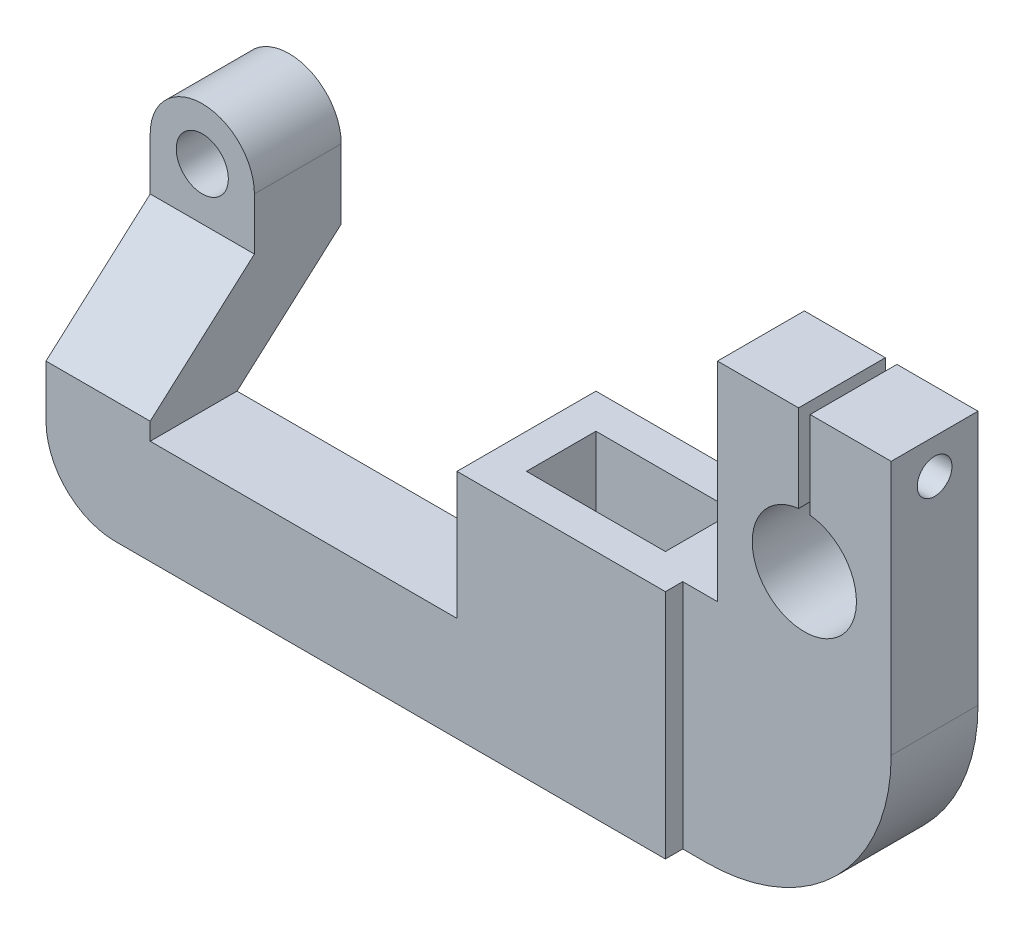
ISO-10303-21;
HEADER;
FILE_DESCRIPTION(('STEP AP214'),'2;1');
FILE_NAME('part.step','',(''),(''),'','','');
FILE_SCHEMA(('AUTOMOTIVE_DESIGN { 1 0 10303 214 1 1 1 1 }'));
ENDSEC;
DATA;
#1=APPLICATION_CONTEXT('core data for automotive mechanical design processes');
#2=APPLICATION_PROTOCOL_DEFINITION('international standard','automotive_design',2000,#1);
#3=PRODUCT_CONTEXT('',#1,'mechanical');
#4=PRODUCT('Part','Part','',(#3));
#5=PRODUCT_RELATED_PRODUCT_CATEGORY('part','',(#4));
#6=PRODUCT_DEFINITION_FORMATION('','',#4);
#7=PRODUCT_DEFINITION_CONTEXT('part definition',#1,'design');
#8=PRODUCT_DEFINITION('design','',#6,#7);
#9=PRODUCT_DEFINITION_SHAPE('','',#8);
#10=(LENGTH_UNIT() NAMED_UNIT(*) SI_UNIT(.MILLI.,.METRE.));
#11=(NAMED_UNIT(*) PLANE_ANGLE_UNIT() SI_UNIT($,.RADIAN.));
#12=(NAMED_UNIT(*) SI_UNIT($,.STERADIAN.) SOLID_ANGLE_UNIT());
#13=UNCERTAINTY_MEASURE_WITH_UNIT(LENGTH_MEASURE(1.E-05),#10,'distance_accuracy_value','');
#14=(GEOMETRIC_REPRESENTATION_CONTEXT(3) GLOBAL_UNCERTAINTY_ASSIGNED_CONTEXT((#13)) GLOBAL_UNIT_ASSIGNED_CONTEXT((#10,
#11,#12)) REPRESENTATION_CONTEXT('',''));
#15=CARTESIAN_POINT('',(0.,0.,0.));
#16=DIRECTION('',(0.,0.,1.));
#17=DIRECTION('',(1.,0.,0.));
#18=AXIS2_PLACEMENT_3D('',#15,#16,#17);
#19=CARTESIAN_POINT('',(28.9370419387053,0.,-6.));
#20=DIRECTION('',(-1.,0.,0.));
#21=DIRECTION('',(0.,0.,1.));
#22=AXIS2_PLACEMENT_3D('',#19,#20,#21);
#23=PLANE('',#22);
#24=DIRECTION('',(0.,1.,0.));
#25=VECTOR('',#24,1.);
#26=CARTESIAN_POINT('',(28.9370419387053,0.,0.));
#27=LINE('',#26,#25);
#28=CARTESIAN_POINT('',(28.9370419387053,-11.3553757337916,0.));
#29=VERTEX_POINT('',#28);
#30=CARTESIAN_POINT('',(28.9370419387053,28.6446242662084,0.));
#31=VERTEX_POINT('',#30);
#32=EDGE_CURVE('E246',#29,#31,#27,.T.);
#33=ORIENTED_EDGE('',*,*,#32,.F.);
#34=DIRECTION('',(0.,0.,1.));
#35=VECTOR('',#34,1.);
#36=CARTESIAN_POINT('',(28.9370419387053,-11.3553757337916,-6.));
#37=LINE('',#36,#35);
#38=CARTESIAN_POINT('',(28.9370419387053,-11.3553757337916,-6.));
#39=VERTEX_POINT('',#38);
#40=EDGE_CURVE('E420',#39,#29,#37,.T.);
#41=ORIENTED_EDGE('',*,*,#40,.F.);
#42=DIRECTION('',(0.,-1.,0.));
#43=VECTOR('',#42,1.);
#44=CARTESIAN_POINT('',(28.9370419387053,0.,-6.));
#45=LINE('',#44,#43);
#46=CARTESIAN_POINT('',(28.9370419387053,28.6446242662084,-6.));
#47=VERTEX_POINT('',#46);
#48=EDGE_CURVE('E389',#47,#39,#45,.T.);
#49=ORIENTED_EDGE('',*,*,#48,.F.);
#50=DIRECTION('',(0.,0.,1.));
#51=VECTOR('',#50,1.);
#52=CARTESIAN_POINT('',(28.9370419387053,28.6446242662084,-6.));
#53=LINE('',#52,#51);
#54=EDGE_CURVE('E416',#47,#31,#53,.T.);
#55=ORIENTED_EDGE('',*,*,#54,.T.);
#56=EDGE_LOOP('',(#33,#41,#49,#55));
#57=FACE_BOUND('',#56,.T.);
#58=ADVANCED_FACE('F41',(#57),#23,.F.);
#59=CARTESIAN_POINT('',(-69.0629580612947,34.6446242662084,-15.));
#60=DIRECTION('',(0.,0.,1.));
#61=DIRECTION('',(1.,0.,0.));
#62=AXIS2_PLACEMENT_3D('',#59,#60,#61);
#63=CYLINDRICAL_SURFACE('',#62,9.00000000000001);
#64=CARTESIAN_POINT('',(-69.0629580612947,34.6446242662084,0.));
#65=DIRECTION('',(0.,0.,1.));
#66=DIRECTION('',(1.,0.,0.));
#67=AXIS2_PLACEMENT_3D('',#64,#65,#66);
#68=CIRCLE('',#67,9.00000000000001);
#69=CARTESIAN_POINT('',(-60.0629580612947,34.6446242662084,0.));
#70=VERTEX_POINT('',#69);
#71=CARTESIAN_POINT('',(-78.0629580612947,34.6446242662084,0.));
#72=VERTEX_POINT('',#71);
#73=EDGE_CURVE('E497',#70,#72,#68,.T.);
#74=ORIENTED_EDGE('',*,*,#73,.F.);
#75=DIRECTION('',(0.,0.,1.));
#76=VECTOR('',#75,1.);
#77=CARTESIAN_POINT('',(-60.0629580612947,34.6446242662084,-15.));
#78=LINE('',#77,#76);
#79=CARTESIAN_POINT('',(-60.0629580612947,34.6446242662084,-15.));
#80=VERTEX_POINT('',#79);
#81=EDGE_CURVE('E528',#80,#70,#78,.T.);
#82=ORIENTED_EDGE('',*,*,#81,.F.);
#83=CARTESIAN_POINT('',(-69.0629580612947,34.6446242662084,-15.));
#84=DIRECTION('',(0.,0.,1.));
#85=DIRECTION('',(1.,0.,0.));
#86=AXIS2_PLACEMENT_3D('',#83,#84,#85);
#87=CIRCLE('',#86,9.00000000000001);
#88=CARTESIAN_POINT('',(-78.0629580612947,34.6446242662084,-15.));
#89=VERTEX_POINT('',#88);
#90=EDGE_CURVE('E501',#80,#89,#87,.T.);
#91=ORIENTED_EDGE('',*,*,#90,.T.);
#92=DIRECTION('',(0.,0.,1.));
#93=VECTOR('',#92,1.);
#94=CARTESIAN_POINT('',(-78.0629580612947,34.6446242662084,-15.));
#95=LINE('',#94,#93);
#96=EDGE_CURVE('E513',#89,#72,#95,.T.);
#97=ORIENTED_EDGE('',*,*,#96,.T.);
#98=EDGE_LOOP('',(#74,#82,#91,#97));
#99=FACE_BOUND('',#98,.T.);
#100=ADVANCED_FACE('F43',(#99),#63,.T.);
#101=CARTESIAN_POINT('',(-60.0629580612947,34.6446242662084,-15.));
#102=DIRECTION('',(1.,0.,0.));
#103=DIRECTION('',(0.,0.,-1.));
#104=AXIS2_PLACEMENT_3D('',#101,#102,#103);
#105=PLANE('',#104);
#106=DIRECTION('',(0.,0.66436383882992,-0.74740931868366));
#107=VECTOR('',#106,1.);
#108=CARTESIAN_POINT('',(-60.0629580612947,37.0653139213809,-12.848275862069));
#109=LINE('',#108,#107);
#110=CARTESIAN_POINT('',(-60.0629580612947,9.64462426620844,18.));
#111=VERTEX_POINT('',#110);
#112=CARTESIAN_POINT('',(-60.0629580612947,25.6446242662084,0.));
#113=VERTEX_POINT('',#112);
#114=EDGE_CURVE('E473',#111,#113,#109,.T.);
#115=ORIENTED_EDGE('',*,*,#114,.F.);
#116=DIRECTION('',(0.,-1.,0.));
#117=VECTOR('',#116,1.);
#118=CARTESIAN_POINT('',(-60.0629580612947,0.,18.));
#119=LINE('',#118,#117);
#120=CARTESIAN_POINT('',(-60.0629580612947,6.64462426620844,18.));
#121=VERTEX_POINT('',#120);
#122=EDGE_CURVE('E484',#111,#121,#119,.T.);
#123=ORIENTED_EDGE('',*,*,#122,.T.);
#124=DIRECTION('',(0.,0.,-1.));
#125=VECTOR('',#124,1.);
#126=CARTESIAN_POINT('',(-60.0629580612947,6.64462426620844,18.));
#127=LINE('',#126,#125);
#128=CARTESIAN_POINT('',(-60.0629580612947,6.64462426620844,3.));
#129=VERTEX_POINT('',#128);
#130=EDGE_CURVE('E488',#121,#129,#127,.T.);
#131=ORIENTED_EDGE('',*,*,#130,.T.);
#132=DIRECTION('',(0.,-0.66436383882992,0.74740931868366));
#133=VECTOR('',#132,1.);
#134=CARTESIAN_POINT('',(-60.0629580612947,27.9411759903464,-20.9586206896552));
#135=LINE('',#134,#133);
#136=CARTESIAN_POINT('',(-60.0629580612947,22.6446242662084,-15.));
#137=VERTEX_POINT('',#136);
#138=EDGE_CURVE('E476',#137,#129,#135,.T.);
#139=ORIENTED_EDGE('',*,*,#138,.F.);
#140=DIRECTION('',(0.,1.,0.));
#141=VECTOR('',#140,1.);
#142=CARTESIAN_POINT('',(-60.0629580612947,34.6446242662084,-15.));
#143=LINE('',#142,#141);
#144=EDGE_CURVE('E510',#137,#80,#143,.T.);
#145=ORIENTED_EDGE('',*,*,#144,.T.);
#146=ORIENTED_EDGE('',*,*,#81,.T.);
#147=DIRECTION('',(0.,1.,0.));
#148=VECTOR('',#147,1.);
#149=CARTESIAN_POINT('',(-60.0629580612947,34.6446242662084,0.));
#150=LINE('',#149,#148);
#151=EDGE_CURVE('E506',#113,#70,#150,.T.);
#152=ORIENTED_EDGE('',*,*,#151,.F.);
#153=EDGE_LOOP('',(#115,#123,#131,#139,#145,#146,#152));
#154=FACE_BOUND('',#153,.T.);
#155=ADVANCED_FACE('F561',(#154),#105,.T.);
#156=CARTESIAN_POINT('',(-78.0629580612947,34.6446242662084,-15.));
#157=DIRECTION('',(-1.,0.,0.));
#158=DIRECTION('',(0.,0.,1.));
#159=AXIS2_PLACEMENT_3D('',#156,#157,#158);
#160=PLANE('',#159);
#161=DIRECTION('',(0.,-0.66436383882992,0.74740931868366));
#162=VECTOR('',#161,1.);
#163=CARTESIAN_POINT('',(-78.0629580612947,9.64462426620844,18.));
#164=LINE('',#163,#162);
#165=CARTESIAN_POINT('',(-78.0629580612947,25.6446242662084,0.));
#166=VERTEX_POINT('',#165);
#167=CARTESIAN_POINT('',(-78.0629580612947,9.64462426620844,18.));
#168=VERTEX_POINT('',#167);
#169=EDGE_CURVE('E457',#166,#168,#164,.T.);
#170=ORIENTED_EDGE('',*,*,#169,.F.);
#171=DIRECTION('',(0.,-1.,0.));
#172=VECTOR('',#171,1.);
#173=CARTESIAN_POINT('',(-78.0629580612947,34.6446242662084,0.));
#174=LINE('',#173,#172);
#175=EDGE_CURVE('E517',#72,#166,#174,.T.);
#176=ORIENTED_EDGE('',*,*,#175,.F.);
#177=ORIENTED_EDGE('',*,*,#96,.F.);
#178=DIRECTION('',(0.,-1.,0.));
#179=VECTOR('',#178,1.);
#180=CARTESIAN_POINT('',(-78.0629580612947,34.6446242662084,-15.));
#181=LINE('',#180,#179);
#182=CARTESIAN_POINT('',(-78.0629580612947,22.6446242662084,-15.));
#183=VERTEX_POINT('',#182);
#184=EDGE_CURVE('E505',#89,#183,#181,.T.);
#185=ORIENTED_EDGE('',*,*,#184,.T.);
#186=DIRECTION('',(0.,0.66436383882992,-0.74740931868366));
#187=VECTOR('',#186,1.);
#188=CARTESIAN_POINT('',(-78.0629580612947,6.64462426620844,3.));
#189=LINE('',#188,#187);
#190=CARTESIAN_POINT('',(-78.0629580612947,6.64462426620844,3.));
#191=VERTEX_POINT('',#190);
#192=EDGE_CURVE('E466',#191,#183,#189,.T.);
#193=ORIENTED_EDGE('',*,*,#192,.F.);
#194=DIRECTION('',(0.,-1.,0.));
#195=VECTOR('',#194,1.);
#196=CARTESIAN_POINT('',(-78.0629580612947,6.64462426620844,3.));
#197=LINE('',#196,#195);
#198=CARTESIAN_POINT('',(-78.0629580612947,0.644624266208527,3.));
#199=VERTEX_POINT('',#198);
#200=EDGE_CURVE('E426',#191,#199,#197,.T.);
#201=ORIENTED_EDGE('',*,*,#200,.T.);
#202=DIRECTION('',(0.,0.,1.));
#203=VECTOR('',#202,1.);
#204=CARTESIAN_POINT('',(-78.0629580612947,0.644624266208527,3.));
#205=LINE('',#204,#203);
#206=CARTESIAN_POINT('',(-78.0629580612947,0.644624266208527,18.));
#207=VERTEX_POINT('',#206);
#208=EDGE_CURVE('E442',#199,#207,#205,.T.);
#209=ORIENTED_EDGE('',*,*,#208,.T.);
#210=DIRECTION('',(0.,1.,0.));
#211=VECTOR('',#210,1.);
#212=CARTESIAN_POINT('',(-78.0629580612947,0.,18.));
#213=LINE('',#212,#211);
#214=EDGE_CURVE('E480',#207,#168,#213,.T.);
#215=ORIENTED_EDGE('',*,*,#214,.T.);
#216=EDGE_LOOP('',(#170,#176,#177,#185,#193,#201,#209,#215));
#217=FACE_BOUND('',#216,.T.);
#218=ADVANCED_FACE('F548',(#217),#160,.T.);
#219=CARTESIAN_POINT('',(-69.0629580612947,34.6446242662084,-15.));
#220=DIRECTION('',(0.,0.,1.));
#221=DIRECTION('',(1.,0.,0.));
#222=AXIS2_PLACEMENT_3D('',#219,#220,#221);
#223=PLANE('',#222);
#224=CARTESIAN_POINT('',(-69.0629580612947,34.6446242662084,-15.));
#225=DIRECTION('',(0.,0.,1.));
#226=DIRECTION('',(1.,0.,0.));
#227=AXIS2_PLACEMENT_3D('',#224,#225,#226);
#228=CIRCLE('',#227,4.5);
#229=CARTESIAN_POINT('',(-64.5629580612947,34.6446242662084,-15.));
#230=VERTEX_POINT('',#229);
#231=EDGE_CURVE('E493',#230,#230,#228,.T.);
#232=ORIENTED_EDGE('',*,*,#231,.T.);
#233=EDGE_LOOP('',(#232));
#234=FACE_BOUND('',#233,.T.);
#235=ORIENTED_EDGE('',*,*,#144,.F.);
#236=DIRECTION('',(-1.,0.,0.));
#237=VECTOR('',#236,1.);
#238=CARTESIAN_POINT('',(-45.0629580612947,22.6446242662084,-15.));
#239=LINE('',#238,#237);
#240=EDGE_CURVE('E469',#137,#183,#239,.T.);
#241=ORIENTED_EDGE('',*,*,#240,.T.);
#242=ORIENTED_EDGE('',*,*,#184,.F.);
#243=ORIENTED_EDGE('',*,*,#90,.F.);
#244=EDGE_LOOP('',(#235,#241,#242,#243));
#245=FACE_BOUND('',#244,.T.);
#246=ADVANCED_FACE('F554',(#234,#245),#223,.F.);
#247=CARTESIAN_POINT('',(-69.0629580612947,34.6446242662084,0.));
#248=DIRECTION('',(0.,0.,1.));
#249=DIRECTION('',(1.,0.,0.));
#250=AXIS2_PLACEMENT_3D('',#247,#248,#249);
#251=PLANE('',#250);
#252=CARTESIAN_POINT('',(-69.0629580612947,34.6446242662084,0.));
#253=DIRECTION('',(0.,0.,1.));
#254=DIRECTION('',(1.,0.,0.));
#255=AXIS2_PLACEMENT_3D('',#252,#253,#254);
#256=CIRCLE('',#255,4.5);
#257=CARTESIAN_POINT('',(-64.5629580612947,34.6446242662084,0.));
#258=VERTEX_POINT('',#257);
#259=EDGE_CURVE('E492',#258,#258,#256,.T.);
#260=ORIENTED_EDGE('',*,*,#259,.F.);
#261=EDGE_LOOP('',(#260));
#262=FACE_BOUND('',#261,.T.);
#263=ORIENTED_EDGE('',*,*,#73,.T.);
#264=ORIENTED_EDGE('',*,*,#175,.T.);
#265=DIRECTION('',(1.,0.,0.));
#266=VECTOR('',#265,1.);
#267=CARTESIAN_POINT('',(-60.0629580612947,25.6446242662084,0.));
#268=LINE('',#267,#266);
#269=EDGE_CURVE('E521',#166,#113,#268,.T.);
#270=ORIENTED_EDGE('',*,*,#269,.T.);
#271=ORIENTED_EDGE('',*,*,#151,.T.);
#272=EDGE_LOOP('',(#263,#264,#270,#271));
#273=FACE_BOUND('',#272,.T.);
#274=ADVANCED_FACE('F727',(#262,#273),#251,.T.);
#275=CARTESIAN_POINT('',(-69.0629580612947,34.6446242662084,-15.));
#276=DIRECTION('',(0.,0.,1.));
#277=DIRECTION('',(1.,0.,0.));
#278=AXIS2_PLACEMENT_3D('',#275,#276,#277);
#279=CYLINDRICAL_SURFACE('',#278,4.5);
#280=ORIENTED_EDGE('',*,*,#231,.F.);
#281=EDGE_LOOP('',(#280));
#282=FACE_BOUND('',#281,.T.);
#283=ORIENTED_EDGE('',*,*,#259,.T.);
#284=EDGE_LOOP('',(#283));
#285=FACE_BOUND('',#284,.T.);
#286=ADVANCED_FACE('F736',(#282,#285),#279,.F.);
#287=CARTESIAN_POINT('',(0.,0.,18.));
#288=DIRECTION('',(0.,0.,-1.));
#289=DIRECTION('',(-1.,0.,0.));
#290=AXIS2_PLACEMENT_3D('',#287,#288,#289);
#291=PLANE('',#290);
#292=ORIENTED_EDGE('',*,*,#122,.F.);
#293=DIRECTION('',(-1.,0.,0.));
#294=VECTOR('',#293,1.);
#295=CARTESIAN_POINT('',(0.,9.64462426620844,18.));
#296=LINE('',#295,#294);
#297=EDGE_CURVE('E531',#111,#168,#296,.T.);
#298=ORIENTED_EDGE('',*,*,#297,.T.);
#299=ORIENTED_EDGE('',*,*,#214,.F.);
#300=CARTESIAN_POINT('',(-66.0629580612947,0.644624266208439,18.));
#301=DIRECTION('',(0.,0.,1.));
#302=DIRECTION('',(-1.,0.,0.));
#303=AXIS2_PLACEMENT_3D('',#300,#301,#302);
#304=CIRCLE('',#303,12.);
#305=CARTESIAN_POINT('',(-66.0629580612946,-11.3553757337916,18.));
#306=VERTEX_POINT('',#305);
#307=EDGE_CURVE('E446',#207,#306,#304,.T.);
#308=ORIENTED_EDGE('',*,*,#307,.T.);
#309=DIRECTION('',(1.,0.,0.));
#310=VECTOR('',#309,1.);
#311=CARTESIAN_POINT('',(-66.0629580612946,-11.3553757337916,18.));
#312=LINE('',#311,#310);
#313=CARTESIAN_POINT('',(28.9370419387053,-11.3553757337916,18.));
#314=VERTEX_POINT('',#313);
#315=EDGE_CURVE('E427',#306,#314,#312,.T.);
#316=ORIENTED_EDGE('',*,*,#315,.T.);
#317=DIRECTION('',(0.,-1.,0.));
#318=VECTOR('',#317,1.);
#319=CARTESIAN_POINT('',(28.9370419387053,0.,18.));
#320=LINE('',#319,#318);
#321=CARTESIAN_POINT('',(28.9370419387053,28.6446242662084,18.));
#322=VERTEX_POINT('',#321);
#323=EDGE_CURVE('E384',#322,#314,#320,.T.);
#324=ORIENTED_EDGE('',*,*,#323,.F.);
#325=DIRECTION('',(1.,0.,0.));
#326=VECTOR('',#325,1.);
#327=CARTESIAN_POINT('',(0.,28.6446242662084,18.));
#328=LINE('',#327,#326);
#329=CARTESIAN_POINT('',(-7.06295806129466,28.6446242662084,18.));
#330=VERTEX_POINT('',#329);
#331=EDGE_CURVE('E401',#330,#322,#328,.T.);
#332=ORIENTED_EDGE('',*,*,#331,.F.);
#333=DIRECTION('',(0.,1.,0.));
#334=VECTOR('',#333,1.);
#335=CARTESIAN_POINT('',(-7.06295806129466,0.,18.));
#336=LINE('',#335,#334);
#337=CARTESIAN_POINT('',(-7.06295806129466,6.64462426620844,18.));
#338=VERTEX_POINT('',#337);
#339=EDGE_CURVE('E390',#338,#330,#336,.T.);
#340=ORIENTED_EDGE('',*,*,#339,.F.);
#341=DIRECTION('',(-1.,0.,0.));
#342=VECTOR('',#341,1.);
#343=CARTESIAN_POINT('',(-7.06295806129466,6.64462426620844,18.));
#344=LINE('',#343,#342);
#345=EDGE_CURVE('E411',#338,#121,#344,.T.);
#346=ORIENTED_EDGE('',*,*,#345,.T.);
#347=EDGE_LOOP('',(#292,#298,#299,#308,#316,#324,#332,#340,#346));
#348=FACE_BOUND('',#347,.T.);
#349=ADVANCED_FACE('F567',(#348),#291,.F.);
#350=CARTESIAN_POINT('',(-45.0629580612947,9.64462426620844,18.));
#351=DIRECTION('',(0.,-0.74740931868366,-0.66436383882992));
#352=DIRECTION('',(0.,0.66436383882992,-0.74740931868366));
#353=AXIS2_PLACEMENT_3D('',#350,#351,#352);
#354=PLANE('',#353);
#355=ORIENTED_EDGE('',*,*,#114,.T.);
#356=ORIENTED_EDGE('',*,*,#269,.F.);
#357=ORIENTED_EDGE('',*,*,#169,.T.);
#358=ORIENTED_EDGE('',*,*,#297,.F.);
#359=EDGE_LOOP('',(#355,#356,#357,#358));
#360=FACE_BOUND('',#359,.T.);
#361=ADVANCED_FACE('F728',(#360),#354,.F.);
#362=CARTESIAN_POINT('',(-45.0629580612947,6.64462426620844,3.));
#363=DIRECTION('',(0.,0.74740931868366,0.66436383882992));
#364=DIRECTION('',(0.,-0.66436383882992,0.74740931868366));
#365=AXIS2_PLACEMENT_3D('',#362,#363,#364);
#366=PLANE('',#365);
#367=ORIENTED_EDGE('',*,*,#138,.T.);
#368=DIRECTION('',(-1.,0.,0.));
#369=VECTOR('',#368,1.);
#370=CARTESIAN_POINT('',(0.,6.64462426620844,3.));
#371=LINE('',#370,#369);
#372=EDGE_CURVE('E51',#129,#191,#371,.T.);
#373=ORIENTED_EDGE('',*,*,#372,.T.);
#374=ORIENTED_EDGE('',*,*,#192,.T.);
#375=ORIENTED_EDGE('',*,*,#240,.F.);
#376=EDGE_LOOP('',(#367,#373,#374,#375));
#377=FACE_BOUND('',#376,.T.);
#378=ADVANCED_FACE('F542',(#377),#366,.F.);
#379=CARTESIAN_POINT('',(-7.06295806129466,6.64462426620844,3.));
#380=DIRECTION('',(0.,1.,0.));
#381=DIRECTION('',(0.,0.,1.));
#382=AXIS2_PLACEMENT_3D('',#379,#380,#381);
#383=PLANE('',#382);
#384=ORIENTED_EDGE('',*,*,#130,.F.);
#385=ORIENTED_EDGE('',*,*,#345,.F.);
#386=DIRECTION('',(0.,0.,1.));
#387=VECTOR('',#386,1.);
#388=CARTESIAN_POINT('',(-7.06295806129466,6.64462426620844,3.));
#389=LINE('',#388,#387);
#390=CARTESIAN_POINT('',(-7.06295806129466,6.64462426620844,3.));
#391=VERTEX_POINT('',#390);
#392=EDGE_CURVE('E453',#391,#338,#389,.T.);
#393=ORIENTED_EDGE('',*,*,#392,.F.);
#394=DIRECTION('',(-1.,0.,0.));
#395=VECTOR('',#394,1.);
#396=CARTESIAN_POINT('',(-7.06295806129466,6.64462426620844,3.));
#397=LINE('',#396,#395);
#398=EDGE_CURVE('E423',#391,#129,#397,.T.);
#399=ORIENTED_EDGE('',*,*,#398,.T.);
#400=EDGE_LOOP('',(#384,#385,#393,#399));
#401=FACE_BOUND('',#400,.T.);
#402=ADVANCED_FACE('F564',(#401),#383,.T.);
#403=CARTESIAN_POINT('',(-66.0629580612946,-11.3553757337916,3.));
#404=DIRECTION('',(0.,-1.,0.));
#405=DIRECTION('',(0.,0.,-1.));
#406=AXIS2_PLACEMENT_3D('',#403,#404,#405);
#407=PLANE('',#406);
#408=DIRECTION('',(-1.,0.,0.));
#409=VECTOR('',#408,1.);
#410=CARTESIAN_POINT('',(-66.0629580612946,-11.3553757337916,12.));
#411=LINE('',#410,#409);
#412=CARTESIAN_POINT('',(22.9370419387053,-11.3553757337916,12.));
#413=VERTEX_POINT('',#412);
#414=CARTESIAN_POINT('',(-1.06295806129466,-11.3553757337916,12.));
#415=VERTEX_POINT('',#414);
#416=EDGE_CURVE('E362',#413,#415,#411,.T.);
#417=ORIENTED_EDGE('',*,*,#416,.F.);
#418=DIRECTION('',(0.,0.,1.));
#419=VECTOR('',#418,1.);
#420=CARTESIAN_POINT('',(22.9370419387053,-11.3553757337916,3.));
#421=LINE('',#420,#419);
#422=CARTESIAN_POINT('',(22.9370419387053,-11.3553757337916,0.));
#423=VERTEX_POINT('',#422);
#424=EDGE_CURVE('E374',#423,#413,#421,.T.);
#425=ORIENTED_EDGE('',*,*,#424,.F.);
#426=DIRECTION('',(1.,0.,0.));
#427=VECTOR('',#426,1.);
#428=CARTESIAN_POINT('',(-66.0629580612946,-11.3553757337916,0.));
#429=LINE('',#428,#427);
#430=CARTESIAN_POINT('',(-1.06295806129466,-11.3553757337916,0.));
#431=VERTEX_POINT('',#430);
#432=EDGE_CURVE('E378',#431,#423,#429,.T.);
#433=ORIENTED_EDGE('',*,*,#432,.F.);
#434=DIRECTION('',(0.,0.,-1.));
#435=VECTOR('',#434,1.);
#436=CARTESIAN_POINT('',(-1.06295806129465,-11.3553757337916,2.99999999999999));
#437=LINE('',#436,#435);
#438=EDGE_CURVE('E381',#415,#431,#437,.T.);
#439=ORIENTED_EDGE('',*,*,#438,.F.);
#440=EDGE_LOOP('',(#417,#425,#433,#439));
#441=FACE_BOUND('',#440,.T.);
#442=DIRECTION('',(1.,0.,0.));
#443=VECTOR('',#442,1.);
#444=CARTESIAN_POINT('',(22.9370419387053,-11.3553757337916,15.));
#445=LINE('',#444,#443);
#446=CARTESIAN_POINT('',(28.9370419387053,-11.3553757337916,15.));
#447=VERTEX_POINT('',#446);
#448=CARTESIAN_POINT('',(32.9370419387051,-11.3553757337916,15.));
#449=VERTEX_POINT('',#448);
#450=EDGE_CURVE('E226',#447,#449,#445,.T.);
#451=ORIENTED_EDGE('',*,*,#450,.F.);
#452=EDGE_CURVE('E61',#447,#314,#37,.T.);
#453=ORIENTED_EDGE('',*,*,#452,.T.);
#454=ORIENTED_EDGE('',*,*,#315,.F.);
#455=DIRECTION('',(0.,0.,1.));
#456=VECTOR('',#455,1.);
#457=CARTESIAN_POINT('',(-66.0629580612946,-11.3553757337916,3.));
#458=LINE('',#457,#456);
#459=CARTESIAN_POINT('',(-66.0629580612946,-11.3553757337916,3.));
#460=VERTEX_POINT('',#459);
#461=EDGE_CURVE('E458',#460,#306,#458,.T.);
#462=ORIENTED_EDGE('',*,*,#461,.F.);
#463=DIRECTION('',(1.,0.,0.));
#464=VECTOR('',#463,1.);
#465=CARTESIAN_POINT('',(-66.0629580612946,-11.3553757337916,3.));
#466=LINE('',#465,#464);
#467=CARTESIAN_POINT('',(-7.06295806129466,-11.3553757337916,3.));
#468=VERTEX_POINT('',#467);
#469=EDGE_CURVE('E435',#460,#468,#466,.T.);
#470=ORIENTED_EDGE('',*,*,#469,.T.);
#471=DIRECTION('',(0.,0.,1.));
#472=VECTOR('',#471,1.);
#473=CARTESIAN_POINT('',(-7.06295806129466,-11.3553757337916,-6.));
#474=LINE('',#473,#472);
#475=CARTESIAN_POINT('',(-7.06295806129466,-11.3553757337916,-6.));
#476=VERTEX_POINT('',#475);
#477=EDGE_CURVE('E407',#476,#468,#474,.T.);
#478=ORIENTED_EDGE('',*,*,#477,.F.);
#479=DIRECTION('',(-1.,0.,0.));
#480=VECTOR('',#479,1.);
#481=CARTESIAN_POINT('',(0.,-11.3553757337916,-6.));
#482=LINE('',#481,#480);
#483=EDGE_CURVE('E385',#39,#476,#482,.T.);
#484=ORIENTED_EDGE('',*,*,#483,.F.);
#485=ORIENTED_EDGE('',*,*,#40,.T.);
#486=DIRECTION('',(1.,0.,0.));
#487=VECTOR('',#486,1.);
#488=CARTESIAN_POINT('',(22.9370419387053,-11.3553757337916,0.));
#489=LINE('',#488,#487);
#490=CARTESIAN_POINT('',(32.9370419387051,-11.3553757337916,0.));
#491=VERTEX_POINT('',#490);
#492=EDGE_CURVE('E242',#29,#491,#489,.T.);
#493=ORIENTED_EDGE('',*,*,#492,.T.);
#494=DIRECTION('',(0.,0.,-1.));
#495=VECTOR('',#494,1.);
#496=CARTESIAN_POINT('',(32.9370419387051,-11.3553757337916,15.));
#497=LINE('',#496,#495);
#498=EDGE_CURVE('E238',#449,#491,#497,.T.);
#499=ORIENTED_EDGE('',*,*,#498,.F.);
#500=EDGE_LOOP('',(#451,#453,#454,#462,#470,#478,#484,#485,#493,#499));
#501=FACE_BOUND('',#500,.T.);
#502=ADVANCED_FACE('F239',(#441,#501),#407,.T.);
#503=CARTESIAN_POINT('',(-66.0629580612947,0.644624266208439,3.));
#504=DIRECTION('',(0.,0.,1.));
#505=DIRECTION('',(1.,0.,0.));
#506=AXIS2_PLACEMENT_3D('',#503,#504,#505);
#507=CYLINDRICAL_SURFACE('',#506,12.);
#508=ORIENTED_EDGE('',*,*,#307,.F.);
#509=ORIENTED_EDGE('',*,*,#208,.F.);
#510=CARTESIAN_POINT('',(-66.0629580612947,0.644624266208439,3.));
#511=DIRECTION('',(0.,0.,1.));
#512=DIRECTION('',(-1.,0.,0.));
#513=AXIS2_PLACEMENT_3D('',#510,#511,#512);
#514=CIRCLE('',#513,12.);
#515=EDGE_CURVE('E431',#199,#460,#514,.T.);
#516=ORIENTED_EDGE('',*,*,#515,.T.);
#517=ORIENTED_EDGE('',*,*,#461,.T.);
#518=EDGE_LOOP('',(#508,#509,#516,#517));
#519=FACE_BOUND('',#518,.T.);
#520=ADVANCED_FACE('F589',(#519),#507,.T.);
#521=CARTESIAN_POINT('',(-66.0629580612947,0.644624266208439,3.));
#522=DIRECTION('',(0.,0.,-1.));
#523=DIRECTION('',(-1.,0.,0.));
#524=AXIS2_PLACEMENT_3D('',#521,#522,#523);
#525=PLANE('',#524);
#526=ORIENTED_EDGE('',*,*,#398,.F.);
#527=DIRECTION('',(0.,1.,0.));
#528=VECTOR('',#527,1.);
#529=CARTESIAN_POINT('',(-7.06295806129466,6.64462426620844,3.));
#530=LINE('',#529,#528);
#531=EDGE_CURVE('E438',#468,#391,#530,.T.);
#532=ORIENTED_EDGE('',*,*,#531,.F.);
#533=ORIENTED_EDGE('',*,*,#469,.F.);
#534=ORIENTED_EDGE('',*,*,#515,.F.);
#535=ORIENTED_EDGE('',*,*,#200,.F.);
#536=ORIENTED_EDGE('',*,*,#372,.F.);
#537=EDGE_LOOP('',(#526,#532,#533,#534,#535,#536));
#538=FACE_BOUND('',#537,.T.);
#539=ADVANCED_FACE('F587',(#538),#525,.T.);
#540=CARTESIAN_POINT('',(-7.06295806129466,0.,-6.));
#541=DIRECTION('',(1.,0.,0.));
#542=DIRECTION('',(0.,0.,-1.));
#543=AXIS2_PLACEMENT_3D('',#540,#541,#542);
#544=PLANE('',#543);
#545=ORIENTED_EDGE('',*,*,#477,.T.);
#546=ORIENTED_EDGE('',*,*,#531,.T.);
#547=ORIENTED_EDGE('',*,*,#392,.T.);
#548=ORIENTED_EDGE('',*,*,#339,.T.);
#549=DIRECTION('',(0.,0.,1.));
#550=VECTOR('',#549,1.);
#551=CARTESIAN_POINT('',(-7.06295806129466,28.6446242662084,-6.));
#552=LINE('',#551,#550);
#553=CARTESIAN_POINT('',(-7.06295806129466,28.6446242662084,-6.));
#554=VERTEX_POINT('',#553);
#555=EDGE_CURVE('E412',#554,#330,#552,.T.);
#556=ORIENTED_EDGE('',*,*,#555,.F.);
#557=DIRECTION('',(0.,1.,0.));
#558=VECTOR('',#557,1.);
#559=CARTESIAN_POINT('',(-7.06295806129466,0.,-6.));
#560=LINE('',#559,#558);
#561=EDGE_CURVE('E396',#476,#554,#560,.T.);
#562=ORIENTED_EDGE('',*,*,#561,.F.);
#563=EDGE_LOOP('',(#545,#546,#547,#548,#556,#562));
#564=FACE_BOUND('',#563,.T.);
#565=ADVANCED_FACE('F572',(#564),#544,.F.);
#566=CARTESIAN_POINT('',(0.,28.6446242662084,-6.));
#567=DIRECTION('',(0.,-1.,0.));
#568=DIRECTION('',(0.,0.,-1.));
#569=AXIS2_PLACEMENT_3D('',#566,#567,#568);
#570=PLANE('',#569);
#571=DIRECTION('',(0.,0.,-1.));
#572=VECTOR('',#571,1.);
#573=CARTESIAN_POINT('',(22.9370419387053,28.6446242662084,0.));
#574=LINE('',#573,#572);
#575=CARTESIAN_POINT('',(22.9370419387053,28.6446242662084,12.));
#576=VERTEX_POINT('',#575);
#577=CARTESIAN_POINT('',(22.9370419387053,28.6446242662084,0.));
#578=VERTEX_POINT('',#577);
#579=EDGE_CURVE('E350',#576,#578,#574,.T.);
#580=ORIENTED_EDGE('',*,*,#579,.F.);
#581=DIRECTION('',(1.,0.,0.));
#582=VECTOR('',#581,1.);
#583=CARTESIAN_POINT('',(-1.06295806129466,28.6446242662084,12.));
#584=LINE('',#583,#582);
#585=CARTESIAN_POINT('',(-1.06295806129466,28.6446242662084,12.));
#586=VERTEX_POINT('',#585);
#587=EDGE_CURVE('E346',#586,#576,#584,.T.);
#588=ORIENTED_EDGE('',*,*,#587,.F.);
#589=DIRECTION('',(0.,0.,1.));
#590=VECTOR('',#589,1.);
#591=CARTESIAN_POINT('',(-1.06295806129466,28.6446242662084,0.));
#592=LINE('',#591,#590);
#593=CARTESIAN_POINT('',(-1.06295806129466,28.6446242662084,0.));
#594=VERTEX_POINT('',#593);
#595=EDGE_CURVE('E343',#594,#586,#592,.T.);
#596=ORIENTED_EDGE('',*,*,#595,.F.);
#597=DIRECTION('',(-1.,0.,0.));
#598=VECTOR('',#597,1.);
#599=CARTESIAN_POINT('',(-1.06295806129466,28.6446242662084,0.));
#600=LINE('',#599,#598);
#601=EDGE_CURVE('E354',#578,#594,#600,.T.);
#602=ORIENTED_EDGE('',*,*,#601,.F.);
#603=EDGE_LOOP('',(#580,#588,#596,#602));
#604=FACE_BOUND('',#603,.T.);
#605=CARTESIAN_POINT('',(28.9370419387053,28.6446242662084,15.));
#606=VERTEX_POINT('',#605);
#607=EDGE_CURVE('E419',#606,#322,#53,.T.);
#608=ORIENTED_EDGE('',*,*,#607,.F.);
#609=DIRECTION('',(-1.,0.,0.));
#610=VECTOR('',#609,1.);
#611=CARTESIAN_POINT('',(22.9370419387053,28.6446242662084,15.));
#612=LINE('',#611,#610);
#613=CARTESIAN_POINT('',(34.9370419387053,28.6446242662084,15.));
#614=VERTEX_POINT('',#613);
#615=EDGE_CURVE('E277',#614,#606,#612,.T.);
#616=ORIENTED_EDGE('',*,*,#615,.F.);
#617=DIRECTION('',(0.,0.,-1.));
#618=VECTOR('',#617,1.);
#619=CARTESIAN_POINT('',(34.9370419387053,28.6446242662084,15.));
#620=LINE('',#619,#618);
#621=CARTESIAN_POINT('',(34.9370419387053,28.6446242662084,0.));
#622=VERTEX_POINT('',#621);
#623=EDGE_CURVE('E280',#614,#622,#620,.T.);
#624=ORIENTED_EDGE('',*,*,#623,.T.);
#625=DIRECTION('',(-1.,0.,0.));
#626=VECTOR('',#625,1.);
#627=CARTESIAN_POINT('',(22.9370419387053,28.6446242662084,0.));
#628=LINE('',#627,#626);
#629=EDGE_CURVE('E235',#622,#31,#628,.T.);
#630=ORIENTED_EDGE('',*,*,#629,.T.);
#631=ORIENTED_EDGE('',*,*,#54,.F.);
#632=DIRECTION('',(1.,0.,0.));
#633=VECTOR('',#632,1.);
#634=CARTESIAN_POINT('',(0.,28.6446242662084,-6.));
#635=LINE('',#634,#633);
#636=EDGE_CURVE('E393',#554,#47,#635,.T.);
#637=ORIENTED_EDGE('',*,*,#636,.F.);
#638=ORIENTED_EDGE('',*,*,#555,.T.);
#639=ORIENTED_EDGE('',*,*,#331,.T.);
#640=EDGE_LOOP('',(#608,#616,#624,#630,#631,#637,#638,#639));
#641=FACE_BOUND('',#640,.T.);
#642=ADVANCED_FACE('F575',(#604,#641),#570,.F.);
#643=ORIENTED_EDGE('',*,*,#452,.F.);
#644=DIRECTION('',(0.,1.,0.));
#645=VECTOR('',#644,1.);
#646=CARTESIAN_POINT('',(28.9370419387053,0.,15.));
#647=LINE('',#646,#645);
#648=EDGE_CURVE('E11',#447,#606,#647,.T.);
#649=ORIENTED_EDGE('',*,*,#648,.T.);
#650=ORIENTED_EDGE('',*,*,#607,.T.);
#651=ORIENTED_EDGE('',*,*,#323,.T.);
#652=EDGE_LOOP('',(#643,#649,#650,#651));
#653=FACE_BOUND('',#652,.T.);
#654=ADVANCED_FACE('F602',(#653),#23,.F.);
#655=CARTESIAN_POINT('',(0.,0.,-6.));
#656=DIRECTION('',(0.,0.,1.));
#657=DIRECTION('',(1.,0.,0.));
#658=AXIS2_PLACEMENT_3D('',#655,#656,#657);
#659=PLANE('',#658);
#660=ORIENTED_EDGE('',*,*,#483,.T.);
#661=ORIENTED_EDGE('',*,*,#561,.T.);
#662=ORIENTED_EDGE('',*,*,#636,.T.);
#663=ORIENTED_EDGE('',*,*,#48,.T.);
#664=EDGE_LOOP('',(#660,#661,#662,#663));
#665=FACE_BOUND('',#664,.T.);
#666=ADVANCED_FACE('F579',(#665),#659,.F.);
#667=CARTESIAN_POINT('',(-1.06295806129466,-28.3553757337916,0.));
#668=DIRECTION('',(-1.,0.,0.));
#669=DIRECTION('',(0.,0.,1.));
#670=AXIS2_PLACEMENT_3D('',#667,#668,#669);
#671=PLANE('',#670);
#672=ORIENTED_EDGE('',*,*,#438,.T.);
#673=DIRECTION('',(0.,1.,0.));
#674=VECTOR('',#673,1.);
#675=CARTESIAN_POINT('',(-1.06295806129466,-28.3553757337916,0.));
#676=LINE('',#675,#674);
#677=EDGE_CURVE('E359',#431,#594,#676,.T.);
#678=ORIENTED_EDGE('',*,*,#677,.T.);
#679=ORIENTED_EDGE('',*,*,#595,.T.);
#680=DIRECTION('',(0.,1.,0.));
#681=VECTOR('',#680,1.);
#682=CARTESIAN_POINT('',(-1.06295806129466,-28.3553757337916,12.));
#683=LINE('',#682,#681);
#684=EDGE_CURVE('E358',#415,#586,#683,.T.);
#685=ORIENTED_EDGE('',*,*,#684,.F.);
#686=EDGE_LOOP('',(#672,#678,#679,#685));
#687=FACE_BOUND('',#686,.T.);
#688=ADVANCED_FACE('F612',(#687),#671,.F.);
#689=CARTESIAN_POINT('',(-1.06295806129466,-28.3553757337916,0.));
#690=DIRECTION('',(0.,0.,-1.));
#691=DIRECTION('',(-1.,0.,0.));
#692=AXIS2_PLACEMENT_3D('',#689,#690,#691);
#693=PLANE('',#692);
#694=ORIENTED_EDGE('',*,*,#432,.T.);
#695=DIRECTION('',(0.,1.,0.));
#696=VECTOR('',#695,1.);
#697=CARTESIAN_POINT('',(22.9370419387053,-28.3553757337916,0.));
#698=LINE('',#697,#696);
#699=EDGE_CURVE('E363',#423,#578,#698,.T.);
#700=ORIENTED_EDGE('',*,*,#699,.T.);
#701=ORIENTED_EDGE('',*,*,#601,.T.);
#702=ORIENTED_EDGE('',*,*,#677,.F.);
#703=EDGE_LOOP('',(#694,#700,#701,#702));
#704=FACE_BOUND('',#703,.T.);
#705=ADVANCED_FACE('F621',(#704),#693,.F.);
#706=CARTESIAN_POINT('',(22.9370419387053,-28.3553757337916,0.));
#707=DIRECTION('',(1.,0.,0.));
#708=DIRECTION('',(0.,0.,-1.));
#709=AXIS2_PLACEMENT_3D('',#706,#707,#708);
#710=PLANE('',#709);
#711=ORIENTED_EDGE('',*,*,#424,.T.);
#712=DIRECTION('',(0.,1.,0.));
#713=VECTOR('',#712,1.);
#714=CARTESIAN_POINT('',(22.9370419387053,-28.3553757337916,12.));
#715=LINE('',#714,#713);
#716=EDGE_CURVE('E366',#413,#576,#715,.T.);
#717=ORIENTED_EDGE('',*,*,#716,.T.);
#718=ORIENTED_EDGE('',*,*,#579,.T.);
#719=ORIENTED_EDGE('',*,*,#699,.F.);
#720=EDGE_LOOP('',(#711,#717,#718,#719));
#721=FACE_BOUND('',#720,.T.);
#722=ADVANCED_FACE('F626',(#721),#710,.F.);
#723=CARTESIAN_POINT('',(-1.06295806129466,-28.3553757337916,12.));
#724=DIRECTION('',(0.,0.,1.));
#725=DIRECTION('',(1.,0.,0.));
#726=AXIS2_PLACEMENT_3D('',#723,#724,#725);
#727=PLANE('',#726);
#728=ORIENTED_EDGE('',*,*,#416,.T.);
#729=ORIENTED_EDGE('',*,*,#684,.T.);
#730=ORIENTED_EDGE('',*,*,#587,.T.);
#731=ORIENTED_EDGE('',*,*,#716,.F.);
#732=EDGE_LOOP('',(#728,#729,#730,#731));
#733=FACE_BOUND('',#732,.T.);
#734=ADVANCED_FACE('F623',(#733),#727,.F.);
#735=CARTESIAN_POINT('',(32.9370419387054,20.6446242662084,15.));
#736=DIRECTION('',(0.,0.,1.));
#737=DIRECTION('',(1.,0.,0.));
#738=AXIS2_PLACEMENT_3D('',#735,#736,#737);
#739=PLANE('',#738);
#740=ORIENTED_EDGE('',*,*,#648,.F.);
#741=ORIENTED_EDGE('',*,*,#450,.T.);
#742=CARTESIAN_POINT('',(32.9370419387054,20.6446242662084,15.));
#743=DIRECTION('',(0.,0.,1.));
#744=DIRECTION('',(1.,0.,0.));
#745=AXIS2_PLACEMENT_3D('',#742,#743,#744);
#746=CIRCLE('',#745,32.);
#747=CARTESIAN_POINT('',(64.9370419387053,20.6446242662087,15.));
#748=VERTEX_POINT('',#747);
#749=EDGE_CURVE('E230',#449,#748,#746,.T.);
#750=ORIENTED_EDGE('',*,*,#749,.T.);
#751=DIRECTION('',(0.,1.,0.));
#752=VECTOR('',#751,1.);
#753=CARTESIAN_POINT('',(64.9370419387053,20.6446242662087,15.));
#754=LINE('',#753,#752);
#755=CARTESIAN_POINT('',(64.9370419387053,64.6446242662084,15.));
#756=VERTEX_POINT('',#755);
#757=EDGE_CURVE('E253',#748,#756,#754,.T.);
#758=ORIENTED_EDGE('',*,*,#757,.T.);
#759=DIRECTION('',(-1.,0.,0.));
#760=VECTOR('',#759,1.);
#761=CARTESIAN_POINT('',(64.9370419387053,64.6446242662084,15.));
#762=LINE('',#761,#760);
#763=CARTESIAN_POINT('',(50.9370419387053,64.6446242662084,15.));
#764=VERTEX_POINT('',#763);
#765=EDGE_CURVE('E256',#756,#764,#762,.T.);
#766=ORIENTED_EDGE('',*,*,#765,.T.);
#767=DIRECTION('',(0.,-1.,0.));
#768=VECTOR('',#767,1.);
#769=CARTESIAN_POINT('',(50.9370419387053,64.6446242662084,15.));
#770=LINE('',#769,#768);
#771=CARTESIAN_POINT('',(50.9370419387053,49.5888961762076,15.));
#772=VERTEX_POINT('',#771);
#773=EDGE_CURVE('E262',#764,#772,#770,.T.);
#774=ORIENTED_EDGE('',*,*,#773,.T.);
#775=CARTESIAN_POINT('',(49.9370419387053,40.6446242662085,15.));
#776=DIRECTION('',(0.,0.,-1.));
#777=DIRECTION('',(1.,0.,0.));
#778=AXIS2_PLACEMENT_3D('',#775,#776,#777);
#779=CIRCLE('',#778,8.99999999999998);
#780=CARTESIAN_POINT('',(48.9370419387053,49.5888961762076,15.));
#781=VERTEX_POINT('',#780);
#782=EDGE_CURVE('E265',#772,#781,#779,.T.);
#783=ORIENTED_EDGE('',*,*,#782,.T.);
#784=DIRECTION('',(0.,1.,0.));
#785=VECTOR('',#784,1.);
#786=CARTESIAN_POINT('',(48.9370419387053,64.6446242662084,15.));
#787=LINE('',#786,#785);
#788=CARTESIAN_POINT('',(48.9370419387053,64.6446242662084,15.));
#789=VERTEX_POINT('',#788);
#790=EDGE_CURVE('E268',#781,#789,#787,.T.);
#791=ORIENTED_EDGE('',*,*,#790,.T.);
#792=DIRECTION('',(-1.,0.,0.));
#793=VECTOR('',#792,1.);
#794=CARTESIAN_POINT('',(48.9370419387053,64.6446242662084,15.));
#795=LINE('',#794,#793);
#796=CARTESIAN_POINT('',(34.9370419387053,64.6446242662084,15.));
#797=VERTEX_POINT('',#796);
#798=EDGE_CURVE('E271',#789,#797,#795,.T.);
#799=ORIENTED_EDGE('',*,*,#798,.T.);
#800=DIRECTION('',(0.,-1.,0.));
#801=VECTOR('',#800,1.);
#802=CARTESIAN_POINT('',(34.9370419387053,64.6446242662084,15.));
#803=LINE('',#802,#801);
#804=EDGE_CURVE('E274',#797,#614,#803,.T.);
#805=ORIENTED_EDGE('',*,*,#804,.T.);
#806=ORIENTED_EDGE('',*,*,#615,.T.);
#807=EDGE_LOOP('',(#740,#741,#750,#758,#766,#774,#783,#791,#799,#805,#806));
#808=FACE_BOUND('',#807,.T.);
#809=ADVANCED_FACE('F228',(#808),#739,.T.);
#810=CARTESIAN_POINT('',(32.9370419387054,20.6446242662084,0.));
#811=DIRECTION('',(0.,0.,1.));
#812=DIRECTION('',(1.,0.,0.));
#813=AXIS2_PLACEMENT_3D('',#810,#811,#812);
#814=PLANE('',#813);
#815=ORIENTED_EDGE('',*,*,#492,.F.);
#816=ORIENTED_EDGE('',*,*,#32,.T.);
#817=ORIENTED_EDGE('',*,*,#629,.F.);
#818=DIRECTION('',(0.,-1.,0.));
#819=VECTOR('',#818,1.);
#820=CARTESIAN_POINT('',(34.9370419387053,64.6446242662084,0.));
#821=LINE('',#820,#819);
#822=CARTESIAN_POINT('',(34.9370419387053,64.6446242662084,0.));
#823=VERTEX_POINT('',#822);
#824=EDGE_CURVE('E305',#823,#622,#821,.T.);
#825=ORIENTED_EDGE('',*,*,#824,.F.);
#826=DIRECTION('',(-1.,0.,0.));
#827=VECTOR('',#826,1.);
#828=CARTESIAN_POINT('',(48.9370419387053,64.6446242662084,0.));
#829=LINE('',#828,#827);
#830=CARTESIAN_POINT('',(48.9370419387053,64.6446242662084,0.));
#831=VERTEX_POINT('',#830);
#832=EDGE_CURVE('E302',#831,#823,#829,.T.);
#833=ORIENTED_EDGE('',*,*,#832,.F.);
#834=DIRECTION('',(0.,1.,0.));
#835=VECTOR('',#834,1.);
#836=CARTESIAN_POINT('',(48.9370419387053,64.6446242662084,0.));
#837=LINE('',#836,#835);
#838=CARTESIAN_POINT('',(48.9370419387053,49.5888961762076,0.));
#839=VERTEX_POINT('',#838);
#840=EDGE_CURVE('E299',#839,#831,#837,.T.);
#841=ORIENTED_EDGE('',*,*,#840,.F.);
#842=CARTESIAN_POINT('',(49.9370419387053,40.6446242662085,0.));
#843=DIRECTION('',(0.,0.,-1.));
#844=DIRECTION('',(1.,0.,0.));
#845=AXIS2_PLACEMENT_3D('',#842,#843,#844);
#846=CIRCLE('',#845,8.99999999999998);
#847=CARTESIAN_POINT('',(50.9370419387053,49.5888961762076,0.));
#848=VERTEX_POINT('',#847);
#849=EDGE_CURVE('E296',#848,#839,#846,.T.);
#850=ORIENTED_EDGE('',*,*,#849,.F.);
#851=DIRECTION('',(0.,-1.,0.));
#852=VECTOR('',#851,1.);
#853=CARTESIAN_POINT('',(50.9370419387053,64.6446242662084,0.));
#854=LINE('',#853,#852);
#855=CARTESIAN_POINT('',(50.9370419387053,64.6446242662084,0.));
#856=VERTEX_POINT('',#855);
#857=EDGE_CURVE('E293',#856,#848,#854,.T.);
#858=ORIENTED_EDGE('',*,*,#857,.F.);
#859=DIRECTION('',(-1.,0.,0.));
#860=VECTOR('',#859,1.);
#861=CARTESIAN_POINT('',(64.9370419387053,64.6446242662084,0.));
#862=LINE('',#861,#860);
#863=CARTESIAN_POINT('',(64.9370419387053,64.6446242662084,0.));
#864=VERTEX_POINT('',#863);
#865=EDGE_CURVE('E290',#864,#856,#862,.T.);
#866=ORIENTED_EDGE('',*,*,#865,.F.);
#867=DIRECTION('',(0.,1.,0.));
#868=VECTOR('',#867,1.);
#869=CARTESIAN_POINT('',(64.9370419387053,20.6446242662087,0.));
#870=LINE('',#869,#868);
#871=CARTESIAN_POINT('',(64.9370419387053,20.6446242662087,0.));
#872=VERTEX_POINT('',#871);
#873=EDGE_CURVE('E287',#872,#864,#870,.T.);
#874=ORIENTED_EDGE('',*,*,#873,.F.);
#875=CARTESIAN_POINT('',(32.9370419387054,20.6446242662084,0.));
#876=DIRECTION('',(0.,0.,1.));
#877=DIRECTION('',(1.,0.,0.));
#878=AXIS2_PLACEMENT_3D('',#875,#876,#877);
#879=CIRCLE('',#878,32.);
#880=EDGE_CURVE('E283',#491,#872,#879,.T.);
#881=ORIENTED_EDGE('',*,*,#880,.F.);
#882=EDGE_LOOP('',(#815,#816,#817,#825,#833,#841,#850,#858,#866,#874,#881));
#883=FACE_BOUND('',#882,.T.);
#884=ADVANCED_FACE('F637',(#883),#814,.F.);
#885=CARTESIAN_POINT('',(32.9370419387054,20.6446242662084,15.));
#886=DIRECTION('',(0.,0.,-1.));
#887=DIRECTION('',(-1.,0.,0.));
#888=AXIS2_PLACEMENT_3D('',#885,#886,#887);
#889=CYLINDRICAL_SURFACE('',#888,32.);
#890=ORIENTED_EDGE('',*,*,#880,.T.);
#891=DIRECTION('',(0.,0.,-1.));
#892=VECTOR('',#891,1.);
#893=CARTESIAN_POINT('',(64.9370419387053,20.6446242662087,15.));
#894=LINE('',#893,#892);
#895=EDGE_CURVE('E247',#748,#872,#894,.T.);
#896=ORIENTED_EDGE('',*,*,#895,.F.);
#897=ORIENTED_EDGE('',*,*,#749,.F.);
#898=ORIENTED_EDGE('',*,*,#498,.T.);
#899=EDGE_LOOP('',(#890,#896,#897,#898));
#900=FACE_BOUND('',#899,.T.);
#901=ADVANCED_FACE('F249',(#900),#889,.T.);
#902=CARTESIAN_POINT('',(64.9370419387053,20.6446242662087,15.));
#903=DIRECTION('',(-1.,0.,0.));
#904=DIRECTION('',(0.,0.,1.));
#905=AXIS2_PLACEMENT_3D('',#902,#903,#904);
#906=PLANE('',#905);
#907=CARTESIAN_POINT('',(64.9370419387053,58.6446242662084,7.5));
#908=DIRECTION('',(1.,0.,0.));
#909=DIRECTION('',(0.,0.,-1.));
#910=AXIS2_PLACEMENT_3D('',#907,#908,#909);
#911=CIRCLE('',#910,3.);
#912=CARTESIAN_POINT('',(64.9370419387053,58.6446242662084,4.5));
#913=VERTEX_POINT('',#912);
#914=EDGE_CURVE('E681',#913,#913,#911,.T.);
#915=ORIENTED_EDGE('',*,*,#914,.F.);
#916=EDGE_LOOP('',(#915));
#917=FACE_BOUND('',#916,.T.);
#918=ORIENTED_EDGE('',*,*,#873,.T.);
#919=DIRECTION('',(0.,0.,-1.));
#920=VECTOR('',#919,1.);
#921=CARTESIAN_POINT('',(64.9370419387053,64.6446242662084,15.));
#922=LINE('',#921,#920);
#923=EDGE_CURVE('E334',#756,#864,#922,.T.);
#924=ORIENTED_EDGE('',*,*,#923,.F.);
#925=ORIENTED_EDGE('',*,*,#757,.F.);
#926=ORIENTED_EDGE('',*,*,#895,.T.);
#927=EDGE_LOOP('',(#918,#924,#925,#926));
#928=FACE_BOUND('',#927,.T.);
#929=ADVANCED_FACE('F636',(#917,#928),#906,.F.);
#930=CARTESIAN_POINT('',(64.9370419387053,64.6446242662084,15.));
#931=DIRECTION('',(0.,-1.,0.));
#932=DIRECTION('',(0.,0.,-1.));
#933=AXIS2_PLACEMENT_3D('',#930,#931,#932);
#934=PLANE('',#933);
#935=ORIENTED_EDGE('',*,*,#865,.T.);
#936=DIRECTION('',(0.,0.,-1.));
#937=VECTOR('',#936,1.);
#938=CARTESIAN_POINT('',(50.9370419387053,64.6446242662084,15.));
#939=LINE('',#938,#937);
#940=EDGE_CURVE('E330',#764,#856,#939,.T.);
#941=ORIENTED_EDGE('',*,*,#940,.F.);
#942=ORIENTED_EDGE('',*,*,#765,.F.);
#943=ORIENTED_EDGE('',*,*,#923,.T.);
#944=EDGE_LOOP('',(#935,#941,#942,#943));
#945=FACE_BOUND('',#944,.T.);
#946=ADVANCED_FACE('F640',(#945),#934,.F.);
#947=CARTESIAN_POINT('',(50.9370419387053,64.6446242662084,15.));
#948=DIRECTION('',(1.,0.,0.));
#949=DIRECTION('',(0.,0.,-1.));
#950=AXIS2_PLACEMENT_3D('',#947,#948,#949);
#951=PLANE('',#950);
#952=CARTESIAN_POINT('',(50.9370419387053,58.6446242662084,7.5));
#953=DIRECTION('',(1.,0.,0.));
#954=DIRECTION('',(0.,0.,-1.));
#955=AXIS2_PLACEMENT_3D('',#952,#953,#954);
#956=CIRCLE('',#955,3.);
#957=CARTESIAN_POINT('',(50.9370419387053,58.6446242662084,4.5));
#958=VERTEX_POINT('',#957);
#959=EDGE_CURVE('E284',#958,#958,#956,.T.);
#960=ORIENTED_EDGE('',*,*,#959,.T.);
#961=EDGE_LOOP('',(#960));
#962=FACE_BOUND('',#961,.T.);
#963=ORIENTED_EDGE('',*,*,#857,.T.);
#964=DIRECTION('',(0.,0.,-1.));
#965=VECTOR('',#964,1.);
#966=CARTESIAN_POINT('',(50.9370419387053,49.5888961762076,15.));
#967=LINE('',#966,#965);
#968=EDGE_CURVE('E326',#772,#848,#967,.T.);
#969=ORIENTED_EDGE('',*,*,#968,.F.);
#970=ORIENTED_EDGE('',*,*,#773,.F.);
#971=ORIENTED_EDGE('',*,*,#940,.T.);
#972=EDGE_LOOP('',(#963,#969,#970,#971));
#973=FACE_BOUND('',#972,.T.);
#974=ADVANCED_FACE('F644',(#962,#973),#951,.F.);
#975=CARTESIAN_POINT('',(49.9370419387053,40.6446242662085,15.));
#976=DIRECTION('',(0.,0.,-1.));
#977=DIRECTION('',(-1.,0.,0.));
#978=AXIS2_PLACEMENT_3D('',#975,#976,#977);
#979=CYLINDRICAL_SURFACE('',#978,8.99999999999998);
#980=ORIENTED_EDGE('',*,*,#849,.T.);
#981=DIRECTION('',(0.,0.,-1.));
#982=VECTOR('',#981,1.);
#983=CARTESIAN_POINT('',(48.9370419387053,49.5888961762076,15.));
#984=LINE('',#983,#982);
#985=EDGE_CURVE('E322',#781,#839,#984,.T.);
#986=ORIENTED_EDGE('',*,*,#985,.F.);
#987=ORIENTED_EDGE('',*,*,#782,.F.);
#988=ORIENTED_EDGE('',*,*,#968,.T.);
#989=EDGE_LOOP('',(#980,#986,#987,#988));
#990=FACE_BOUND('',#989,.T.);
#991=ADVANCED_FACE('F648',(#990),#979,.F.);
#992=CARTESIAN_POINT('',(48.9370419387053,64.6446242662084,15.));
#993=DIRECTION('',(-1.,0.,0.));
#994=DIRECTION('',(0.,0.,1.));
#995=AXIS2_PLACEMENT_3D('',#992,#993,#994);
#996=PLANE('',#995);
#997=CARTESIAN_POINT('',(48.9370419387053,58.6446242662084,7.5));
#998=DIRECTION('',(-1.,0.,0.));
#999=DIRECTION('',(0.,0.,1.));
#1000=AXIS2_PLACEMENT_3D('',#997,#998,#999);
#1001=CIRCLE('',#1000,3.);
#1002=CARTESIAN_POINT('',(48.9370419387053,58.6446242662084,10.5));
#1003=VERTEX_POINT('',#1002);
#1004=EDGE_CURVE('E685',#1003,#1003,#1001,.T.);
#1005=ORIENTED_EDGE('',*,*,#1004,.T.);
#1006=EDGE_LOOP('',(#1005));
#1007=FACE_BOUND('',#1006,.T.);
#1008=ORIENTED_EDGE('',*,*,#840,.T.);
#1009=DIRECTION('',(0.,0.,-1.));
#1010=VECTOR('',#1009,1.);
#1011=CARTESIAN_POINT('',(48.9370419387053,64.6446242662084,15.));
#1012=LINE('',#1011,#1010);
#1013=EDGE_CURVE('E318',#789,#831,#1012,.T.);
#1014=ORIENTED_EDGE('',*,*,#1013,.F.);
#1015=ORIENTED_EDGE('',*,*,#790,.F.);
#1016=ORIENTED_EDGE('',*,*,#985,.T.);
#1017=EDGE_LOOP('',(#1008,#1014,#1015,#1016));
#1018=FACE_BOUND('',#1017,.T.);
#1019=ADVANCED_FACE('F652',(#1007,#1018),#996,.F.);
#1020=CARTESIAN_POINT('',(48.9370419387053,64.6446242662084,15.));
#1021=DIRECTION('',(0.,-1.,0.));
#1022=DIRECTION('',(0.,0.,-1.));
#1023=AXIS2_PLACEMENT_3D('',#1020,#1021,#1022);
#1024=PLANE('',#1023);
#1025=ORIENTED_EDGE('',*,*,#832,.T.);
#1026=DIRECTION('',(0.,0.,-1.));
#1027=VECTOR('',#1026,1.);
#1028=CARTESIAN_POINT('',(34.9370419387053,64.6446242662084,15.));
#1029=LINE('',#1028,#1027);
#1030=EDGE_CURVE('E314',#797,#823,#1029,.T.);
#1031=ORIENTED_EDGE('',*,*,#1030,.F.);
#1032=ORIENTED_EDGE('',*,*,#798,.F.);
#1033=ORIENTED_EDGE('',*,*,#1013,.T.);
#1034=EDGE_LOOP('',(#1025,#1031,#1032,#1033));
#1035=FACE_BOUND('',#1034,.T.);
#1036=ADVANCED_FACE('F656',(#1035),#1024,.F.);
#1037=CARTESIAN_POINT('',(34.9370419387053,64.6446242662084,15.));
#1038=DIRECTION('',(1.,0.,0.));
#1039=DIRECTION('',(0.,0.,-1.));
#1040=AXIS2_PLACEMENT_3D('',#1037,#1038,#1039);
#1041=PLANE('',#1040);
#1042=CARTESIAN_POINT('',(34.9370419387053,58.6446242662084,7.5));
#1043=DIRECTION('',(1.,0.,0.));
#1044=DIRECTION('',(0.,0.,-1.));
#1045=AXIS2_PLACEMENT_3D('',#1042,#1043,#1044);
#1046=CIRCLE('',#1045,3.);
#1047=CARTESIAN_POINT('',(34.9370419387053,58.6446242662084,4.5));
#1048=VERTEX_POINT('',#1047);
#1049=EDGE_CURVE('E45',#1048,#1048,#1046,.T.);
#1050=ORIENTED_EDGE('',*,*,#1049,.T.);
#1051=EDGE_LOOP('',(#1050));
#1052=FACE_BOUND('',#1051,.T.);
#1053=ORIENTED_EDGE('',*,*,#824,.T.);
#1054=ORIENTED_EDGE('',*,*,#623,.F.);
#1055=ORIENTED_EDGE('',*,*,#804,.F.);
#1056=ORIENTED_EDGE('',*,*,#1030,.T.);
#1057=EDGE_LOOP('',(#1053,#1054,#1055,#1056));
#1058=FACE_BOUND('',#1057,.T.);
#1059=ADVANCED_FACE('F660',(#1052,#1058),#1041,.F.);
#1060=CARTESIAN_POINT('',(17.9370419387053,58.6446242662084,7.5));
#1061=DIRECTION('',(1.,0.,0.));
#1062=DIRECTION('',(0.,0.,-1.));
#1063=AXIS2_PLACEMENT_3D('',#1060,#1061,#1062);
#1064=CYLINDRICAL_SURFACE('',#1063,3.);
#1065=ORIENTED_EDGE('',*,*,#1049,.F.);
#1066=EDGE_LOOP('',(#1065));
#1067=FACE_BOUND('',#1066,.T.);
#1068=ORIENTED_EDGE('',*,*,#1004,.F.);
#1069=EDGE_LOOP('',(#1068));
#1070=FACE_BOUND('',#1069,.T.);
#1071=ADVANCED_FACE('F664',(#1067,#1070),#1064,.F.);
#1072=ORIENTED_EDGE('',*,*,#914,.T.);
#1073=EDGE_LOOP('',(#1072));
#1074=FACE_BOUND('',#1073,.T.);
#1075=ORIENTED_EDGE('',*,*,#959,.F.);
#1076=EDGE_LOOP('',(#1075));
#1077=FACE_BOUND('',#1076,.T.);
#1078=ADVANCED_FACE('F671',(#1074,#1077),#1064,.F.);
#1079=CLOSED_SHELL('',(#58,#100,#155,#218,#246,#274,#286,#349,#361,#378,#402,#502,#520,#539,
#565,#642,#654,#666,#688,#705,#722,#734,#809,#884,#901,#929,#946,#974,#991,#1019,#1036,#1059,
#1071,#1078));
#1080=MANIFOLD_SOLID_BREP('B2',#1079);
#1081=ADVANCED_BREP_SHAPE_REPRESENTATION('',(#18,#1080),#14);
#1082=SHAPE_DEFINITION_REPRESENTATION(#9,#1081);
ENDSEC;
END-ISO-10303-21;
